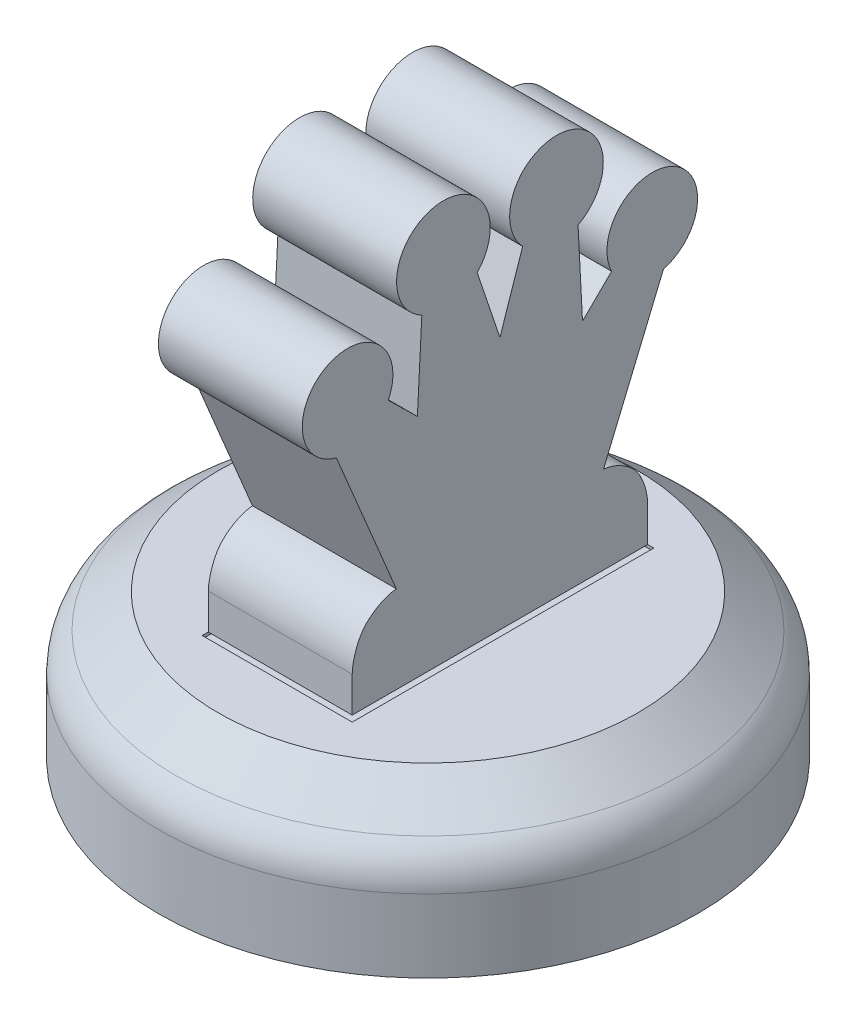
ISO-10303-21;
HEADER;
FILE_DESCRIPTION(('STEP AP214'),'2;1');
FILE_NAME('part.step','',(''),(''),'','','');
FILE_SCHEMA(('AUTOMOTIVE_DESIGN { 1 0 10303 214 1 1 1 1 }'));
ENDSEC;
DATA;
#1=APPLICATION_CONTEXT('core data for automotive mechanical design processes');
#2=APPLICATION_PROTOCOL_DEFINITION('international standard','automotive_design',2000,#1);
#3=PRODUCT_CONTEXT('',#1,'mechanical');
#4=PRODUCT('Part','Part','',(#3));
#5=PRODUCT_RELATED_PRODUCT_CATEGORY('part','',(#4));
#6=PRODUCT_DEFINITION_FORMATION('','',#4);
#7=PRODUCT_DEFINITION_CONTEXT('part definition',#1,'design');
#8=PRODUCT_DEFINITION('design','',#6,#7);
#9=PRODUCT_DEFINITION_SHAPE('','',#8);
#10=(LENGTH_UNIT() NAMED_UNIT(*) SI_UNIT(.MILLI.,.METRE.));
#11=(NAMED_UNIT(*) PLANE_ANGLE_UNIT() SI_UNIT($,.RADIAN.));
#12=(NAMED_UNIT(*) SI_UNIT($,.STERADIAN.) SOLID_ANGLE_UNIT());
#13=UNCERTAINTY_MEASURE_WITH_UNIT(LENGTH_MEASURE(1.E-05),#10,'distance_accuracy_value','');
#14=(GEOMETRIC_REPRESENTATION_CONTEXT(3) GLOBAL_UNCERTAINTY_ASSIGNED_CONTEXT((#13)) GLOBAL_UNIT_ASSIGNED_CONTEXT((#10,
#11,#12)) REPRESENTATION_CONTEXT('',''));
#15=CARTESIAN_POINT('',(0.,0.,0.));
#16=DIRECTION('',(0.,0.,1.));
#17=DIRECTION('',(1.,0.,0.));
#18=AXIS2_PLACEMENT_3D('',#15,#16,#17);
#19=CARTESIAN_POINT('',(4.7625,9.525,9.779));
#20=DIRECTION('',(0.,0.,-1.));
#21=DIRECTION('',(-1.,0.,0.));
#22=AXIS2_PLACEMENT_3D('',#19,#20,#21);
#23=PLANE('',#22);
#24=DIRECTION('',(0.,-1.,0.));
#25=VECTOR('',#24,1.);
#26=CARTESIAN_POINT('',(-4.7625,9.525,9.779));
#27=LINE('',#26,#25);
#28=CARTESIAN_POINT('',(-4.7625,12.065,9.779));
#29=VERTEX_POINT('',#28);
#30=CARTESIAN_POINT('',(-4.7625,9.7234375,9.779));
#31=VERTEX_POINT('',#30);
#32=EDGE_CURVE('E199',#29,#31,#27,.T.);
#33=ORIENTED_EDGE('',*,*,#32,.T.);
#34=DIRECTION('',(1.,0.,0.));
#35=VECTOR('',#34,1.);
#36=CARTESIAN_POINT('',(4.7625,9.7234375,9.779));
#37=LINE('',#36,#35);
#38=CARTESIAN_POINT('',(4.7625,9.7234375,9.779));
#39=VERTEX_POINT('',#38);
#40=EDGE_CURVE('E61',#31,#39,#37,.T.);
#41=ORIENTED_EDGE('',*,*,#40,.T.);
#42=DIRECTION('',(0.,-1.,0.));
#43=VECTOR('',#42,1.);
#44=CARTESIAN_POINT('',(4.7625,9.525,9.779));
#45=LINE('',#44,#43);
#46=CARTESIAN_POINT('',(4.7625,12.065,9.779));
#47=VERTEX_POINT('',#46);
#48=EDGE_CURVE('E370',#47,#39,#45,.T.);
#49=ORIENTED_EDGE('',*,*,#48,.F.);
#50=DIRECTION('',(-1.,0.,0.));
#51=VECTOR('',#50,1.);
#52=CARTESIAN_POINT('',(4.7625,12.065,9.779));
#53=LINE('',#52,#51);
#54=EDGE_CURVE('E192',#47,#29,#53,.T.);
#55=ORIENTED_EDGE('',*,*,#54,.T.);
#56=EDGE_LOOP('',(#33,#41,#49,#55));
#57=FACE_BOUND('',#56,.T.);
#58=ADVANCED_FACE('F47',(#57),#23,.F.);
#59=CARTESIAN_POINT('',(4.7625,9.525,-9.779));
#60=DIRECTION('',(0.,0.,1.));
#61=DIRECTION('',(1.,0.,0.));
#62=AXIS2_PLACEMENT_3D('',#59,#60,#61);
#63=PLANE('',#62);
#64=DIRECTION('',(0.,1.,0.));
#65=VECTOR('',#64,1.);
#66=CARTESIAN_POINT('',(4.7625,9.525,-9.779));
#67=LINE('',#66,#65);
#68=CARTESIAN_POINT('',(4.7625,9.7234375,-9.779));
#69=VERTEX_POINT('',#68);
#70=CARTESIAN_POINT('',(4.7625,12.065,-9.779));
#71=VERTEX_POINT('',#70);
#72=EDGE_CURVE('E131',#69,#71,#67,.T.);
#73=ORIENTED_EDGE('',*,*,#72,.F.);
#74=DIRECTION('',(-1.,0.,0.));
#75=VECTOR('',#74,1.);
#76=CARTESIAN_POINT('',(4.7625,9.7234375,-9.779));
#77=LINE('',#76,#75);
#78=CARTESIAN_POINT('',(-4.7625,9.7234375,-9.779));
#79=VERTEX_POINT('',#78);
#80=EDGE_CURVE('E380',#69,#79,#77,.T.);
#81=ORIENTED_EDGE('',*,*,#80,.T.);
#82=DIRECTION('',(0.,1.,0.));
#83=VECTOR('',#82,1.);
#84=CARTESIAN_POINT('',(-4.7625,9.525,-9.779));
#85=LINE('',#84,#83);
#86=CARTESIAN_POINT('',(-4.7625,12.065,-9.779));
#87=VERTEX_POINT('',#86);
#88=EDGE_CURVE('E337',#79,#87,#85,.T.);
#89=ORIENTED_EDGE('',*,*,#88,.T.);
#90=DIRECTION('',(-1.,0.,0.));
#91=VECTOR('',#90,1.);
#92=CARTESIAN_POINT('',(4.7625,12.065,-9.779));
#93=LINE('',#92,#91);
#94=EDGE_CURVE('E54',#71,#87,#93,.T.);
#95=ORIENTED_EDGE('',*,*,#94,.F.);
#96=EDGE_LOOP('',(#73,#81,#89,#95));
#97=FACE_BOUND('',#96,.T.);
#98=ADVANCED_FACE('F258',(#97),#63,.F.);
#99=CARTESIAN_POINT('',(4.7625,12.065,-9.779));
#100=CARTESIAN_POINT('',(4.7625,12.309468918613,-9.779));
#101=CARTESIAN_POINT('',(4.7625,12.8451886460168,-9.70122474852141));
#102=CARTESIAN_POINT('',(4.7625,13.6120337897192,-9.45354075319584));
#103=CARTESIAN_POINT('',(4.7625,14.3662098327036,-9.0379901102682));
#104=CARTESIAN_POINT('',(4.7625,14.9248956395259,-8.40518758041096));
#105=CARTESIAN_POINT('',(4.7625,15.3380357843992,-7.6672092800667));
#106=CARTESIAN_POINT('',(4.7625,15.476256725142,-7.12932513516018));
#107=CARTESIAN_POINT('',(4.7625,15.5044019386932,-6.85730117364538));
#108=B_SPLINE_CURVE_WITH_KNOTS('',3,(#99,#100,#101,#102,#103,#104,#105,#106,#107),.UNSPECIFIED.,
.F.,.F.,(4,1,1,1,1,1,4),(0.,0.148072563883558,0.327673483859106,0.488762490745578,
0.665615280153017,0.833548992252136,1.),.UNSPECIFIED.);
#109=DIRECTION('',(-1.,0.,0.));
#110=VECTOR('',#109,1.);
#111=SURFACE_OF_LINEAR_EXTRUSION('',#108,#110);
#112=CARTESIAN_POINT('',(-4.7625,12.065,-9.779));
#113=CARTESIAN_POINT('',(-4.7625,12.309468918613,-9.779));
#114=CARTESIAN_POINT('',(-4.7625,12.8451886460168,-9.70122474852141));
#115=CARTESIAN_POINT('',(-4.7625,13.6120337897192,-9.45354075319584));
#116=CARTESIAN_POINT('',(-4.7625,14.3662098327036,-9.0379901102682));
#117=CARTESIAN_POINT('',(-4.7625,14.9248956395259,-8.40518758041096));
#118=CARTESIAN_POINT('',(-4.7625,15.3380357843992,-7.6672092800667));
#119=CARTESIAN_POINT('',(-4.7625,15.476256725142,-7.12932513516018));
#120=CARTESIAN_POINT('',(-4.7625,15.5044019386932,-6.85730117364538));
#121=B_SPLINE_CURVE_WITH_KNOTS('',3,(#112,#113,#114,#115,#116,#117,#118,#119,#120),
.UNSPECIFIED.,.F.,.F.,(4,1,1,1,1,1,4),(0.,0.148072563883558,0.327673483859106,0.488762490745578,
0.665615280153017,0.833548992252136,1.),.UNSPECIFIED.);
#122=CARTESIAN_POINT('',(-4.7625,15.5044019386932,-6.85730117364538));
#123=VERTEX_POINT('',#122);
#124=EDGE_CURVE('E331',#87,#123,#121,.T.);
#125=ORIENTED_EDGE('',*,*,#124,.T.);
#126=DIRECTION('',(-1.,0.,0.));
#127=VECTOR('',#126,1.);
#128=CARTESIAN_POINT('',(4.7625,15.5044019386932,-6.85730117364538));
#129=LINE('',#128,#127);
#130=CARTESIAN_POINT('',(4.7625,15.5044019386932,-6.85730117364538));
#131=VERTEX_POINT('',#130);
#132=EDGE_CURVE('E325',#131,#123,#129,.T.);
#133=ORIENTED_EDGE('',*,*,#132,.F.);
#134=EDGE_CURVE('E260',#71,#131,#108,.T.);
#135=ORIENTED_EDGE('',*,*,#134,.F.);
#136=ORIENTED_EDGE('',*,*,#94,.T.);
#137=EDGE_LOOP('',(#125,#133,#135,#136));
#138=FACE_BOUND('',#137,.T.);
#139=ADVANCED_FACE('F254',(#138),#111,.F.);
#140=CARTESIAN_POINT('',(4.7625,15.5044019386932,-6.85730117364538));
#141=DIRECTION('',(0.,0.385969370221872,0.922511596268866));
#142=DIRECTION('',(0.,-0.922511596268866,0.385969370221872));
#143=AXIS2_PLACEMENT_3D('',#140,#141,#142);
#144=PLANE('',#143);
#145=DIRECTION('',(0.,0.922511596268866,-0.385969370221872));
#146=VECTOR('',#145,1.);
#147=CARTESIAN_POINT('',(-4.7625,15.5044019386932,-6.85730117364538));
#148=LINE('',#147,#146);
#149=CARTESIAN_POINT('',(-4.7625,24.99672792902,-10.8287928050192));
#150=VERTEX_POINT('',#149);
#151=EDGE_CURVE('E339',#123,#150,#148,.T.);
#152=ORIENTED_EDGE('',*,*,#151,.T.);
#153=DIRECTION('',(-1.,0.,0.));
#154=VECTOR('',#153,1.);
#155=CARTESIAN_POINT('',(4.7625,24.99672792902,-10.8287928050192));
#156=LINE('',#155,#154);
#157=CARTESIAN_POINT('',(4.7625,24.99672792902,-10.8287928050192));
#158=VERTEX_POINT('',#157);
#159=EDGE_CURVE('E322',#158,#150,#156,.T.);
#160=ORIENTED_EDGE('',*,*,#159,.F.);
#161=DIRECTION('',(0.,0.922511596268866,-0.385969370221872));
#162=VECTOR('',#161,1.);
#163=CARTESIAN_POINT('',(4.7625,15.5044019386932,-6.85730117364538));
#164=LINE('',#163,#162);
#165=EDGE_CURVE('E266',#131,#158,#164,.T.);
#166=ORIENTED_EDGE('',*,*,#165,.F.);
#167=ORIENTED_EDGE('',*,*,#132,.T.);
#168=EDGE_LOOP('',(#152,#160,#166,#167));
#169=FACE_BOUND('',#168,.T.);
#170=ADVANCED_FACE('F250',(#169),#144,.F.);
#171=CARTESIAN_POINT('',(4.7625,27.903237148507,-10.0855803758841));
#172=DIRECTION('',(-1.,0.,0.));
#173=DIRECTION('',(0.,0.,1.));
#174=AXIS2_PLACEMENT_3D('',#171,#172,#173);
#175=CYLINDRICAL_SURFACE('',#174,3.00002675951138);
#176=CARTESIAN_POINT('',(-4.7625,27.903237148507,-10.0855803758841));
#177=DIRECTION('',(1.,0.,0.));
#178=DIRECTION('',(0.,0.,-1.));
#179=AXIS2_PLACEMENT_3D('',#176,#177,#178);
#180=CIRCLE('',#179,3.00002675951138);
#181=CARTESIAN_POINT('',(-4.7625,26.5829752137657,-7.39168561523409));
#182=VERTEX_POINT('',#181);
#183=EDGE_CURVE('E341',#150,#182,#180,.T.);
#184=ORIENTED_EDGE('',*,*,#183,.T.);
#185=DIRECTION('',(-1.,0.,0.));
#186=VECTOR('',#185,1.);
#187=CARTESIAN_POINT('',(4.7625,26.5829752137657,-7.39168561523409));
#188=LINE('',#187,#186);
#189=CARTESIAN_POINT('',(4.7625,26.5829752137657,-7.39168561523409));
#190=VERTEX_POINT('',#189);
#191=EDGE_CURVE('E319',#190,#182,#188,.T.);
#192=ORIENTED_EDGE('',*,*,#191,.F.);
#193=CARTESIAN_POINT('',(4.7625,27.903237148507,-10.0855803758841));
#194=DIRECTION('',(1.,0.,0.));
#195=DIRECTION('',(0.,0.,-1.));
#196=AXIS2_PLACEMENT_3D('',#193,#194,#195);
#197=CIRCLE('',#196,3.00002675951138);
#198=EDGE_CURVE('E272',#158,#190,#197,.T.);
#199=ORIENTED_EDGE('',*,*,#198,.F.);
#200=ORIENTED_EDGE('',*,*,#159,.T.);
#201=EDGE_LOOP('',(#184,#192,#199,#200));
#202=FACE_BOUND('',#201,.T.);
#203=ADVANCED_FACE('F246',(#202),#175,.T.);
#204=CARTESIAN_POINT('',(4.7625,26.5829752137657,-7.39168561523409));
#205=DIRECTION('',(0.,-0.713106962515212,-0.701055247475067));
#206=DIRECTION('',(0.,0.701055247475067,-0.713106962515212));
#207=AXIS2_PLACEMENT_3D('',#204,#205,#206);
#208=PLANE('',#207);
#209=DIRECTION('',(0.,-0.701055247475067,0.713106962515212));
#210=VECTOR('',#209,1.);
#211=CARTESIAN_POINT('',(-4.7625,26.5829752137657,-7.39168561523409));
#212=LINE('',#211,#210);
#213=CARTESIAN_POINT('',(-4.7625,24.6892122169581,-5.46536727835407));
#214=VERTEX_POINT('',#213);
#215=EDGE_CURVE('E350',#182,#214,#212,.T.);
#216=ORIENTED_EDGE('',*,*,#215,.T.);
#217=DIRECTION('',(-1.,0.,0.));
#218=VECTOR('',#217,1.);
#219=CARTESIAN_POINT('',(4.7625,24.6892122169581,-5.46536727835407));
#220=LINE('',#219,#218);
#221=CARTESIAN_POINT('',(4.7625,24.6892122169581,-5.46536727835407));
#222=VERTEX_POINT('',#221);
#223=EDGE_CURVE('E316',#222,#214,#220,.T.);
#224=ORIENTED_EDGE('',*,*,#223,.F.);
#225=DIRECTION('',(0.,-0.701055247475067,0.713106962515212));
#226=VECTOR('',#225,1.);
#227=CARTESIAN_POINT('',(4.7625,26.5829752137657,-7.39168561523409));
#228=LINE('',#227,#226);
#229=EDGE_CURVE('E274',#190,#222,#228,.T.);
#230=ORIENTED_EDGE('',*,*,#229,.F.);
#231=ORIENTED_EDGE('',*,*,#191,.T.);
#232=EDGE_LOOP('',(#216,#224,#230,#231));
#233=FACE_BOUND('',#232,.T.);
#234=ADVANCED_FACE('F242',(#233),#208,.F.);
#235=CARTESIAN_POINT('',(4.7625,24.6892122169581,-5.46536727835407));
#236=DIRECTION('',(0.,-0.0520601547677918,0.998643950707936));
#237=DIRECTION('',(0.,-0.998643950707936,-0.0520601547677918));
#238=AXIS2_PLACEMENT_3D('',#235,#236,#237);
#239=PLANE('',#238);
#240=DIRECTION('',(0.,0.998643950707935,0.0520601547677918));
#241=VECTOR('',#240,1.);
#242=CARTESIAN_POINT('',(-4.7625,24.6892122169581,-5.46536727835407));
#243=LINE('',#242,#241);
#244=CARTESIAN_POINT('',(-4.7625,30.3496131382739,-5.17028578529286));
#245=VERTEX_POINT('',#244);
#246=EDGE_CURVE('E352',#214,#245,#243,.T.);
#247=ORIENTED_EDGE('',*,*,#246,.T.);
#248=DIRECTION('',(-1.,0.,0.));
#249=VECTOR('',#248,1.);
#250=CARTESIAN_POINT('',(4.7625,30.3496131382739,-5.17028578529286));
#251=LINE('',#250,#249);
#252=CARTESIAN_POINT('',(4.7625,30.3496131382739,-5.17028578529286));
#253=VERTEX_POINT('',#252);
#254=EDGE_CURVE('E313',#253,#245,#251,.T.);
#255=ORIENTED_EDGE('',*,*,#254,.F.);
#256=DIRECTION('',(0.,0.998643950707935,0.0520601547677918));
#257=VECTOR('',#256,1.);
#258=CARTESIAN_POINT('',(4.7625,24.6892122169581,-5.46536727835407));
#259=LINE('',#258,#257);
#260=EDGE_CURVE('E276',#222,#253,#259,.T.);
#261=ORIENTED_EDGE('',*,*,#260,.F.);
#262=ORIENTED_EDGE('',*,*,#223,.T.);
#263=EDGE_LOOP('',(#247,#255,#261,#262));
#264=FACE_BOUND('',#263,.T.);
#265=ADVANCED_FACE('F238',(#264),#239,.F.);
#266=CARTESIAN_POINT('',(4.7625,33.101675129507,-3.74254737761217));
#267=DIRECTION('',(-1.,0.,0.));
#268=DIRECTION('',(0.,0.,1.));
#269=AXIS2_PLACEMENT_3D('',#266,#267,#268);
#270=CYLINDRICAL_SURFACE('',#269,3.1003680691744);
#271=CARTESIAN_POINT('',(-4.7625,33.101675129507,-3.74254737761217));
#272=DIRECTION('',(1.,0.,0.));
#273=DIRECTION('',(0.,0.,-1.));
#274=AXIS2_PLACEMENT_3D('',#271,#272,#273);
#275=CIRCLE('',#274,3.1003680691744);
#276=CARTESIAN_POINT('',(-4.7625,30.9555664452199,-1.5050264995903));
#277=VERTEX_POINT('',#276);
#278=EDGE_CURVE('E354',#245,#277,#275,.T.);
#279=ORIENTED_EDGE('',*,*,#278,.T.);
#280=DIRECTION('',(-1.,0.,0.));
#281=VECTOR('',#280,1.);
#282=CARTESIAN_POINT('',(4.7625,30.9555664452199,-1.5050264995903));
#283=LINE('',#282,#281);
#284=CARTESIAN_POINT('',(4.7625,30.9555664452199,-1.5050264995903));
#285=VERTEX_POINT('',#284);
#286=EDGE_CURVE('E310',#285,#277,#283,.T.);
#287=ORIENTED_EDGE('',*,*,#286,.F.);
#288=CARTESIAN_POINT('',(4.7625,33.101675129507,-3.74254737761217));
#289=DIRECTION('',(1.,0.,0.));
#290=DIRECTION('',(0.,0.,-1.));
#291=AXIS2_PLACEMENT_3D('',#288,#289,#290);
#292=CIRCLE('',#291,3.1003680691744);
#293=EDGE_CURVE('E278',#253,#285,#292,.T.);
#294=ORIENTED_EDGE('',*,*,#293,.F.);
#295=ORIENTED_EDGE('',*,*,#254,.T.);
#296=EDGE_LOOP('',(#279,#287,#294,#295));
#297=FACE_BOUND('',#296,.T.);
#298=ADVANCED_FACE('F234',(#297),#270,.T.);
#299=CARTESIAN_POINT('',(4.7625,30.9555664452199,-1.5050264995903));
#300=DIRECTION('',(0.,-0.318862957576562,-0.947800830494217));
#301=DIRECTION('',(0.,0.947800830494217,-0.318862957576562));
#302=AXIS2_PLACEMENT_3D('',#299,#300,#301);
#303=PLANE('',#302);
#304=DIRECTION('',(0.,-0.947800830494217,0.318862957576562));
#305=VECTOR('',#304,1.);
#306=CARTESIAN_POINT('',(-4.7625,30.9555664452199,-1.5050264995903));
#307=LINE('',#306,#305);
#308=CARTESIAN_POINT('',(-4.7625,26.4819663222423,0.));
#309=VERTEX_POINT('',#308);
#310=EDGE_CURVE('E356',#277,#309,#307,.T.);
#311=ORIENTED_EDGE('',*,*,#310,.T.);
#312=DIRECTION('',(-1.,0.,0.));
#313=VECTOR('',#312,1.);
#314=CARTESIAN_POINT('',(4.7625,26.4819663222423,0.));
#315=LINE('',#314,#313);
#316=CARTESIAN_POINT('',(4.7625,26.4819663222423,0.));
#317=VERTEX_POINT('',#316);
#318=EDGE_CURVE('E307',#317,#309,#315,.T.);
#319=ORIENTED_EDGE('',*,*,#318,.F.);
#320=DIRECTION('',(0.,-0.947800830494217,0.318862957576562));
#321=VECTOR('',#320,1.);
#322=CARTESIAN_POINT('',(4.7625,30.9555664452199,-1.5050264995903));
#323=LINE('',#322,#321);
#324=EDGE_CURVE('E280',#285,#317,#323,.T.);
#325=ORIENTED_EDGE('',*,*,#324,.F.);
#326=ORIENTED_EDGE('',*,*,#286,.T.);
#327=EDGE_LOOP('',(#311,#319,#325,#326));
#328=FACE_BOUND('',#327,.T.);
#329=ADVANCED_FACE('F230',(#328),#303,.F.);
#330=CARTESIAN_POINT('',(4.7625,30.9555664452199,1.5050264995903));
#331=DIRECTION('',(0.,-0.318862957576562,0.947800830494217));
#332=DIRECTION('',(0.,-0.947800830494217,-0.318862957576562));
#333=AXIS2_PLACEMENT_3D('',#330,#331,#332);
#334=PLANE('',#333);
#335=DIRECTION('',(0.,0.947800830494217,0.318862957576562));
#336=VECTOR('',#335,1.);
#337=CARTESIAN_POINT('',(-4.7625,30.9555664452199,1.5050264995903));
#338=LINE('',#337,#336);
#339=CARTESIAN_POINT('',(-4.7625,30.9555664452199,1.5050264995903));
#340=VERTEX_POINT('',#339);
#341=EDGE_CURVE('E358',#309,#340,#338,.T.);
#342=ORIENTED_EDGE('',*,*,#341,.T.);
#343=DIRECTION('',(-1.,0.,0.));
#344=VECTOR('',#343,1.);
#345=CARTESIAN_POINT('',(4.7625,30.9555664452199,1.5050264995903));
#346=LINE('',#345,#344);
#347=CARTESIAN_POINT('',(4.7625,30.9555664452199,1.5050264995903));
#348=VERTEX_POINT('',#347);
#349=EDGE_CURVE('E304',#348,#340,#346,.T.);
#350=ORIENTED_EDGE('',*,*,#349,.F.);
#351=DIRECTION('',(0.,0.947800830494217,0.318862957576562));
#352=VECTOR('',#351,1.);
#353=CARTESIAN_POINT('',(4.7625,30.9555664452199,1.5050264995903));
#354=LINE('',#353,#352);
#355=EDGE_CURVE('E282',#317,#348,#354,.T.);
#356=ORIENTED_EDGE('',*,*,#355,.F.);
#357=ORIENTED_EDGE('',*,*,#318,.T.);
#358=EDGE_LOOP('',(#342,#350,#356,#357));
#359=FACE_BOUND('',#358,.T.);
#360=ADVANCED_FACE('F226',(#359),#334,.F.);
#361=CARTESIAN_POINT('',(4.7625,33.101675129507,3.74254737761217));
#362=DIRECTION('',(-1.,0.,0.));
#363=DIRECTION('',(0.,0.,1.));
#364=AXIS2_PLACEMENT_3D('',#361,#362,#363);
#365=CYLINDRICAL_SURFACE('',#364,3.1003680691744);
#366=CARTESIAN_POINT('',(-4.7625,33.101675129507,3.74254737761217));
#367=DIRECTION('',(1.,0.,0.));
#368=DIRECTION('',(0.,0.,1.));
#369=AXIS2_PLACEMENT_3D('',#366,#367,#368);
#370=CIRCLE('',#369,3.1003680691744);
#371=CARTESIAN_POINT('',(-4.7625,30.3496131382739,5.17028578529286));
#372=VERTEX_POINT('',#371);
#373=EDGE_CURVE('E360',#340,#372,#370,.T.);
#374=ORIENTED_EDGE('',*,*,#373,.T.);
#375=DIRECTION('',(-1.,0.,0.));
#376=VECTOR('',#375,1.);
#377=CARTESIAN_POINT('',(4.7625,30.3496131382739,5.17028578529286));
#378=LINE('',#377,#376);
#379=CARTESIAN_POINT('',(4.7625,30.3496131382739,5.17028578529286));
#380=VERTEX_POINT('',#379);
#381=EDGE_CURVE('E297',#380,#372,#378,.T.);
#382=ORIENTED_EDGE('',*,*,#381,.F.);
#383=CARTESIAN_POINT('',(4.7625,33.101675129507,3.74254737761217));
#384=DIRECTION('',(1.,0.,0.));
#385=DIRECTION('',(0.,0.,1.));
#386=AXIS2_PLACEMENT_3D('',#383,#384,#385);
#387=CIRCLE('',#386,3.1003680691744);
#388=EDGE_CURVE('E284',#348,#380,#387,.T.);
#389=ORIENTED_EDGE('',*,*,#388,.F.);
#390=ORIENTED_EDGE('',*,*,#349,.T.);
#391=EDGE_LOOP('',(#374,#382,#389,#390));
#392=FACE_BOUND('',#391,.T.);
#393=ADVANCED_FACE('F222',(#392),#365,.T.);
#394=CARTESIAN_POINT('',(4.7625,24.6892122169581,5.46536727835407));
#395=DIRECTION('',(0.,-0.0520601547677918,-0.998643950707936));
#396=DIRECTION('',(0.,0.998643950707936,-0.0520601547677918));
#397=AXIS2_PLACEMENT_3D('',#394,#395,#396);
#398=PLANE('',#397);
#399=DIRECTION('',(0.,-0.998643950707935,0.0520601547677918));
#400=VECTOR('',#399,1.);
#401=CARTESIAN_POINT('',(-4.7625,24.6892122169581,5.46536727835407));
#402=LINE('',#401,#400);
#403=CARTESIAN_POINT('',(-4.7625,24.6892122169581,5.46536727835407));
#404=VERTEX_POINT('',#403);
#405=EDGE_CURVE('E295',#372,#404,#402,.T.);
#406=ORIENTED_EDGE('',*,*,#405,.T.);
#407=DIRECTION('',(-1.,0.,0.));
#408=VECTOR('',#407,1.);
#409=CARTESIAN_POINT('',(4.7625,24.6892122169581,5.46536727835407));
#410=LINE('',#409,#408);
#411=CARTESIAN_POINT('',(4.7625,24.6892122169581,5.46536727835407));
#412=VERTEX_POINT('',#411);
#413=EDGE_CURVE('E293',#412,#404,#410,.T.);
#414=ORIENTED_EDGE('',*,*,#413,.F.);
#415=DIRECTION('',(0.,-0.998643950707935,0.0520601547677918));
#416=VECTOR('',#415,1.);
#417=CARTESIAN_POINT('',(4.7625,24.6892122169581,5.46536727835407));
#418=LINE('',#417,#416);
#419=EDGE_CURVE('E286',#380,#412,#418,.T.);
#420=ORIENTED_EDGE('',*,*,#419,.F.);
#421=ORIENTED_EDGE('',*,*,#381,.T.);
#422=EDGE_LOOP('',(#406,#414,#420,#421));
#423=FACE_BOUND('',#422,.T.);
#424=ADVANCED_FACE('F218',(#423),#398,.F.);
#425=CARTESIAN_POINT('',(4.7625,26.5829752137657,7.39168561523409));
#426=DIRECTION('',(0.,-0.713106962515212,0.701055247475067));
#427=DIRECTION('',(0.,-0.701055247475067,-0.713106962515212));
#428=AXIS2_PLACEMENT_3D('',#425,#426,#427);
#429=PLANE('',#428);
#430=DIRECTION('',(0.,0.701055247475067,0.713106962515212));
#431=VECTOR('',#430,1.);
#432=CARTESIAN_POINT('',(-4.7625,26.5829752137657,7.39168561523409));
#433=LINE('',#432,#431);
#434=CARTESIAN_POINT('',(-4.7625,26.5829752137657,7.39168561523409));
#435=VERTEX_POINT('',#434);
#436=EDGE_CURVE('E299',#404,#435,#433,.T.);
#437=ORIENTED_EDGE('',*,*,#436,.T.);
#438=DIRECTION('',(-1.,0.,0.));
#439=VECTOR('',#438,1.);
#440=CARTESIAN_POINT('',(4.7625,26.5829752137657,7.39168561523409));
#441=LINE('',#440,#439);
#442=CARTESIAN_POINT('',(4.7625,26.5829752137657,7.39168561523409));
#443=VERTEX_POINT('',#442);
#444=EDGE_CURVE('E187',#443,#435,#441,.T.);
#445=ORIENTED_EDGE('',*,*,#444,.F.);
#446=DIRECTION('',(0.,0.701055247475067,0.713106962515212));
#447=VECTOR('',#446,1.);
#448=CARTESIAN_POINT('',(4.7625,26.5829752137657,7.39168561523409));
#449=LINE('',#448,#447);
#450=EDGE_CURVE('E175',#412,#443,#449,.T.);
#451=ORIENTED_EDGE('',*,*,#450,.F.);
#452=ORIENTED_EDGE('',*,*,#413,.T.);
#453=EDGE_LOOP('',(#437,#445,#451,#452));
#454=FACE_BOUND('',#453,.T.);
#455=ADVANCED_FACE('F215',(#454),#429,.F.);
#456=CARTESIAN_POINT('',(4.7625,27.903237148507,10.0855803758841));
#457=DIRECTION('',(-1.,0.,0.));
#458=DIRECTION('',(0.,0.,1.));
#459=AXIS2_PLACEMENT_3D('',#456,#457,#458);
#460=CYLINDRICAL_SURFACE('',#459,3.00002675951138);
#461=CARTESIAN_POINT('',(-4.7625,27.903237148507,10.0855803758841));
#462=DIRECTION('',(1.,0.,0.));
#463=DIRECTION('',(0.,0.,1.));
#464=AXIS2_PLACEMENT_3D('',#461,#462,#463);
#465=CIRCLE('',#464,3.00002675951138);
#466=CARTESIAN_POINT('',(-4.7625,24.99672792902,10.8287928050192));
#467=VERTEX_POINT('',#466);
#468=EDGE_CURVE('E184',#435,#467,#465,.T.);
#469=ORIENTED_EDGE('',*,*,#468,.T.);
#470=DIRECTION('',(-1.,0.,0.));
#471=VECTOR('',#470,1.);
#472=CARTESIAN_POINT('',(4.7625,24.99672792902,10.8287928050192));
#473=LINE('',#472,#471);
#474=CARTESIAN_POINT('',(4.7625,24.99672792902,10.8287928050192));
#475=VERTEX_POINT('',#474);
#476=EDGE_CURVE('E181',#475,#467,#473,.T.);
#477=ORIENTED_EDGE('',*,*,#476,.F.);
#478=CARTESIAN_POINT('',(4.7625,27.903237148507,10.0855803758841));
#479=DIRECTION('',(1.,0.,0.));
#480=DIRECTION('',(0.,0.,1.));
#481=AXIS2_PLACEMENT_3D('',#478,#479,#480);
#482=CIRCLE('',#481,3.00002675951138);
#483=EDGE_CURVE('E168',#443,#475,#482,.T.);
#484=ORIENTED_EDGE('',*,*,#483,.F.);
#485=ORIENTED_EDGE('',*,*,#444,.T.);
#486=EDGE_LOOP('',(#469,#477,#484,#485));
#487=FACE_BOUND('',#486,.T.);
#488=ADVANCED_FACE('F182',(#487),#460,.T.);
#489=CARTESIAN_POINT('',(4.7625,15.5044019386932,6.85730117364538));
#490=DIRECTION('',(0.,0.385969370221872,-0.922511596268866));
#491=DIRECTION('',(0.,0.922511596268866,0.385969370221872));
#492=AXIS2_PLACEMENT_3D('',#489,#490,#491);
#493=PLANE('',#492);
#494=DIRECTION('',(0.,-0.922511596268866,-0.385969370221872));
#495=VECTOR('',#494,1.);
#496=CARTESIAN_POINT('',(-4.7625,15.5044019386932,6.85730117364538));
#497=LINE('',#496,#495);
#498=CARTESIAN_POINT('',(-4.7625,15.5044019386932,6.85730117364538));
#499=VERTEX_POINT('',#498);
#500=EDGE_CURVE('E365',#467,#499,#497,.T.);
#501=ORIENTED_EDGE('',*,*,#500,.T.);
#502=DIRECTION('',(-1.,0.,0.));
#503=VECTOR('',#502,1.);
#504=CARTESIAN_POINT('',(4.7625,15.5044019386932,6.85730117364538));
#505=LINE('',#504,#503);
#506=CARTESIAN_POINT('',(4.7625,15.5044019386932,6.85730117364538));
#507=VERTEX_POINT('',#506);
#508=EDGE_CURVE('E188',#507,#499,#505,.T.);
#509=ORIENTED_EDGE('',*,*,#508,.F.);
#510=DIRECTION('',(0.,-0.922511596268866,-0.385969370221872));
#511=VECTOR('',#510,1.);
#512=CARTESIAN_POINT('',(4.7625,15.5044019386932,6.85730117364538));
#513=LINE('',#512,#511);
#514=EDGE_CURVE('E172',#475,#507,#513,.T.);
#515=ORIENTED_EDGE('',*,*,#514,.F.);
#516=ORIENTED_EDGE('',*,*,#476,.T.);
#517=EDGE_LOOP('',(#501,#509,#515,#516));
#518=FACE_BOUND('',#517,.T.);
#519=ADVANCED_FACE('F190',(#518),#493,.F.);
#520=CARTESIAN_POINT('',(4.7625,15.5044019386932,6.85730117364538));
#521=CARTESIAN_POINT('',(4.7625,15.476256725142,7.12932513516018));
#522=CARTESIAN_POINT('',(4.7625,15.3380357843992,7.66720928006671));
#523=CARTESIAN_POINT('',(4.7625,14.9248956395259,8.40518758041096));
#524=CARTESIAN_POINT('',(4.7625,14.3662098327036,9.0379901102682));
#525=CARTESIAN_POINT('',(4.7625,13.6120337897192,9.45354075319584));
#526=CARTESIAN_POINT('',(4.7625,12.8451886460168,9.70122474852141));
#527=CARTESIAN_POINT('',(4.7625,12.309468918613,9.779));
#528=CARTESIAN_POINT('',(4.7625,12.065,9.779));
#529=B_SPLINE_CURVE_WITH_KNOTS('',3,(#520,#521,#522,#523,#524,#525,#526,#527,#528),
.UNSPECIFIED.,.F.,.F.,(4,1,1,1,1,1,4),(0.,0.166451007747864,0.334384719846983,0.511237509254422,
0.672326516140894,0.851927436116442,1.),.UNSPECIFIED.);
#530=DIRECTION('',(-1.,0.,0.));
#531=VECTOR('',#530,1.);
#532=SURFACE_OF_LINEAR_EXTRUSION('',#529,#531);
#533=CARTESIAN_POINT('',(-4.7625,15.5044019386932,6.85730117364538));
#534=CARTESIAN_POINT('',(-4.7625,15.476256725142,7.12932513516018));
#535=CARTESIAN_POINT('',(-4.7625,15.3380357843992,7.66720928006671));
#536=CARTESIAN_POINT('',(-4.7625,14.9248956395259,8.40518758041096));
#537=CARTESIAN_POINT('',(-4.7625,14.3662098327036,9.0379901102682));
#538=CARTESIAN_POINT('',(-4.7625,13.6120337897192,9.45354075319584));
#539=CARTESIAN_POINT('',(-4.7625,12.8451886460168,9.70122474852141));
#540=CARTESIAN_POINT('',(-4.7625,12.309468918613,9.779));
#541=CARTESIAN_POINT('',(-4.7625,12.065,9.779));
#542=B_SPLINE_CURVE_WITH_KNOTS('',3,(#533,#534,#535,#536,#537,#538,#539,#540,#541),
.UNSPECIFIED.,.F.,.F.,(4,1,1,1,1,1,4),(0.,0.166451007747864,0.334384719846983,0.511237509254422,
0.672326516140894,0.851927436116442,1.),.UNSPECIFIED.);
#543=EDGE_CURVE('E123',#499,#29,#542,.T.);
#544=ORIENTED_EDGE('',*,*,#543,.T.);
#545=ORIENTED_EDGE('',*,*,#54,.F.);
#546=EDGE_CURVE('E69',#507,#47,#529,.T.);
#547=ORIENTED_EDGE('',*,*,#546,.F.);
#548=ORIENTED_EDGE('',*,*,#508,.T.);
#549=EDGE_LOOP('',(#544,#545,#547,#548));
#550=FACE_BOUND('',#549,.T.);
#551=ADVANCED_FACE('F205',(#550),#532,.F.);
#552=CARTESIAN_POINT('',(4.7625,14.3592081892217,8.98148465256457));
#553=DIRECTION('',(1.,0.,0.));
#554=DIRECTION('',(0.,0.,-1.));
#555=AXIS2_PLACEMENT_3D('',#552,#553,#554);
#556=PLANE('',#555);
#557=DIRECTION('',(0.,0.,1.));
#558=VECTOR('',#557,1.);
#559=CARTESIAN_POINT('',(4.7625,9.7234375,8.98148465256457));
#560=LINE('',#559,#558);
#561=EDGE_CURVE('E377',#69,#39,#560,.T.);
#562=ORIENTED_EDGE('',*,*,#561,.F.);
#563=ORIENTED_EDGE('',*,*,#72,.T.);
#564=ORIENTED_EDGE('',*,*,#134,.T.);
#565=ORIENTED_EDGE('',*,*,#165,.T.);
#566=ORIENTED_EDGE('',*,*,#198,.T.);
#567=ORIENTED_EDGE('',*,*,#229,.T.);
#568=ORIENTED_EDGE('',*,*,#260,.T.);
#569=ORIENTED_EDGE('',*,*,#293,.T.);
#570=ORIENTED_EDGE('',*,*,#324,.T.);
#571=ORIENTED_EDGE('',*,*,#355,.T.);
#572=ORIENTED_EDGE('',*,*,#388,.T.);
#573=ORIENTED_EDGE('',*,*,#419,.T.);
#574=ORIENTED_EDGE('',*,*,#450,.T.);
#575=ORIENTED_EDGE('',*,*,#483,.T.);
#576=ORIENTED_EDGE('',*,*,#514,.T.);
#577=ORIENTED_EDGE('',*,*,#546,.T.);
#578=ORIENTED_EDGE('',*,*,#48,.T.);
#579=EDGE_LOOP('',(#562,#563,#564,#565,#566,#567,#568,#569,#570,#571,#572,#573,#574,#575,#576,
#577,#578));
#580=FACE_BOUND('',#579,.T.);
#581=ADVANCED_FACE('F170',(#580),#556,.T.);
#582=CARTESIAN_POINT('',(-4.7625,14.3592081892217,8.98148465256457));
#583=DIRECTION('',(1.,0.,0.));
#584=DIRECTION('',(0.,0.,-1.));
#585=AXIS2_PLACEMENT_3D('',#582,#583,#584);
#586=PLANE('',#585);
#587=ORIENTED_EDGE('',*,*,#88,.F.);
#588=DIRECTION('',(0.,0.,1.));
#589=VECTOR('',#588,1.);
#590=CARTESIAN_POINT('',(-4.7625,9.7234375,8.98148465256457));
#591=LINE('',#590,#589);
#592=EDGE_CURVE('E12',#79,#31,#591,.T.);
#593=ORIENTED_EDGE('',*,*,#592,.T.);
#594=ORIENTED_EDGE('',*,*,#32,.F.);
#595=ORIENTED_EDGE('',*,*,#543,.F.);
#596=ORIENTED_EDGE('',*,*,#500,.F.);
#597=ORIENTED_EDGE('',*,*,#468,.F.);
#598=ORIENTED_EDGE('',*,*,#436,.F.);
#599=ORIENTED_EDGE('',*,*,#405,.F.);
#600=ORIENTED_EDGE('',*,*,#373,.F.);
#601=ORIENTED_EDGE('',*,*,#341,.F.);
#602=ORIENTED_EDGE('',*,*,#310,.F.);
#603=ORIENTED_EDGE('',*,*,#278,.F.);
#604=ORIENTED_EDGE('',*,*,#246,.F.);
#605=ORIENTED_EDGE('',*,*,#215,.F.);
#606=ORIENTED_EDGE('',*,*,#183,.F.);
#607=ORIENTED_EDGE('',*,*,#151,.F.);
#608=ORIENTED_EDGE('',*,*,#124,.F.);
#609=EDGE_LOOP('',(#587,#593,#594,#595,#596,#597,#598,#599,#600,#601,#602,#603,#604,#605,#606,
#607,#608));
#610=FACE_BOUND('',#609,.T.);
#611=ADVANCED_FACE('F209',(#610),#586,.F.);
#612=CARTESIAN_POINT('',(0.,9.7234375,0.));
#613=DIRECTION('',(0.,1.,0.));
#614=DIRECTION('',(0.,0.,1.));
#615=AXIS2_PLACEMENT_3D('',#612,#613,#614);
#616=PLANE('',#615);
#617=ORIENTED_EDGE('',*,*,#561,.T.);
#618=ORIENTED_EDGE('',*,*,#40,.F.);
#619=ORIENTED_EDGE('',*,*,#592,.F.);
#620=ORIENTED_EDGE('',*,*,#80,.F.);
#621=EDGE_LOOP('',(#617,#618,#619,#620));
#622=FACE_BOUND('',#621,.T.);
#623=ADVANCED_FACE('F393',(#622),#616,.F.);
#624=CLOSED_SHELL('',(#58,#98,#139,#170,#203,#234,#265,#298,#329,#360,#393,#424,#455,#488,#519,
#551,#581,#611,#623));
#625=MANIFOLD_SOLID_BREP('B2',#624);
#626=CARTESIAN_POINT('',(0.,4.7625,0.));
#627=DIRECTION('',(0.,-1.,0.));
#628=DIRECTION('',(0.,0.,-1.));
#629=AXIS2_PLACEMENT_3D('',#626,#627,#628);
#630=CYLINDRICAL_SURFACE('',#629,2.59079999999997);
#631=CARTESIAN_POINT('',(0.,4.7625,0.));
#632=DIRECTION('',(0.,-1.,0.));
#633=DIRECTION('',(0.,0.,-1.));
#634=AXIS2_PLACEMENT_3D('',#631,#632,#633);
#635=CIRCLE('',#634,2.59079999999999);
#636=CARTESIAN_POINT('',(0.,4.7625,-2.59079999999999));
#637=VERTEX_POINT('',#636);
#638=EDGE_CURVE('E628',#637,#637,#635,.T.);
#639=ORIENTED_EDGE('',*,*,#638,.T.);
#640=EDGE_LOOP('',(#639));
#641=FACE_BOUND('',#640,.T.);
#642=CARTESIAN_POINT('',(0.,9.3265625,0.));
#643=DIRECTION('',(0.,1.,0.));
#644=DIRECTION('',(0.,0.,1.));
#645=AXIS2_PLACEMENT_3D('',#642,#643,#644);
#646=CIRCLE('',#645,2.59079999999997);
#647=CARTESIAN_POINT('',(0.,9.3265625,2.59079999999997));
#648=VERTEX_POINT('',#647);
#649=EDGE_CURVE('E623',#648,#648,#646,.F.);
#650=ORIENTED_EDGE('',*,*,#649,.F.);
#651=EDGE_LOOP('',(#650));
#652=FACE_BOUND('',#651,.T.);
#653=ADVANCED_FACE('F530',(#641,#652),#630,.F.);
#654=CARTESIAN_POINT('',(0.,6.35,0.));
#655=DIRECTION('',(0.,-1.,0.));
#656=DIRECTION('',(0.,0.,-1.));
#657=AXIS2_PLACEMENT_3D('',#654,#655,#656);
#658=CYLINDRICAL_SURFACE('',#657,17.859375);
#659=CARTESIAN_POINT('',(0.,4.82401610923014,0.));
#660=DIRECTION('',(0.,-1.,0.));
#661=DIRECTION('',(1.,0.,0.));
#662=AXIS2_PLACEMENT_3D('',#659,#660,#661);
#663=CIRCLE('',#662,17.859375);
#664=CARTESIAN_POINT('',(17.859375,4.82401610923015,0.));
#665=VERTEX_POINT('',#664);
#666=EDGE_CURVE('E45',#665,#665,#663,.T.);
#667=ORIENTED_EDGE('',*,*,#666,.T.);
#668=EDGE_LOOP('',(#667));
#669=FACE_BOUND('',#668,.T.);
#670=CARTESIAN_POINT('',(0.,0.,0.));
#671=DIRECTION('',(0.,1.,0.));
#672=DIRECTION('',(0.,0.,1.));
#673=AXIS2_PLACEMENT_3D('',#670,#671,#672);
#674=CIRCLE('',#673,17.859375);
#675=CARTESIAN_POINT('',(0.,0.,17.859375));
#676=VERTEX_POINT('',#675);
#677=EDGE_CURVE('E664',#676,#676,#674,.T.);
#678=ORIENTED_EDGE('',*,*,#677,.T.);
#679=EDGE_LOOP('',(#678));
#680=FACE_BOUND('',#679,.T.);
#681=ADVANCED_FACE('F690',(#669,#680),#658,.T.);
#682=CARTESIAN_POINT('',(0.,0.,0.));
#683=DIRECTION('',(0.,1.,0.));
#684=DIRECTION('',(0.,0.,1.));
#685=AXIS2_PLACEMENT_3D('',#682,#683,#684);
#686=PLANE('',#685);
#687=DIRECTION('',(-1.,0.,0.));
#688=VECTOR('',#687,1.);
#689=CARTESIAN_POINT('',(-6.4516,0.,9.6266));
#690=LINE('',#689,#688);
#691=CARTESIAN_POINT('',(6.4516,0.,9.6266));
#692=VERTEX_POINT('',#691);
#693=CARTESIAN_POINT('',(-6.4516,0.,9.6266));
#694=VERTEX_POINT('',#693);
#695=EDGE_CURVE('E646',#692,#694,#690,.T.);
#696=ORIENTED_EDGE('',*,*,#695,.F.);
#697=DIRECTION('',(0.,0.,1.));
#698=VECTOR('',#697,1.);
#699=CARTESIAN_POINT('',(6.4516,0.,-9.6266));
#700=LINE('',#699,#698);
#701=CARTESIAN_POINT('',(6.4516,0.,-9.6266));
#702=VERTEX_POINT('',#701);
#703=EDGE_CURVE('E553',#702,#692,#700,.T.);
#704=ORIENTED_EDGE('',*,*,#703,.F.);
#705=DIRECTION('',(1.,0.,0.));
#706=VECTOR('',#705,1.);
#707=CARTESIAN_POINT('',(-6.4516,0.,-9.6266));
#708=LINE('',#707,#706);
#709=CARTESIAN_POINT('',(-6.4516,0.,-9.6266));
#710=VERTEX_POINT('',#709);
#711=EDGE_CURVE('E635',#710,#702,#708,.T.);
#712=ORIENTED_EDGE('',*,*,#711,.F.);
#713=DIRECTION('',(0.,0.,-1.));
#714=VECTOR('',#713,1.);
#715=CARTESIAN_POINT('',(-6.4516,0.,-9.6266));
#716=LINE('',#715,#714);
#717=EDGE_CURVE('E649',#694,#710,#716,.T.);
#718=ORIENTED_EDGE('',*,*,#717,.F.);
#719=EDGE_LOOP('',(#696,#704,#712,#718));
#720=FACE_BOUND('',#719,.T.);
#721=ORIENTED_EDGE('',*,*,#677,.F.);
#722=EDGE_LOOP('',(#721));
#723=FACE_BOUND('',#722,.T.);
#724=ADVANCED_FACE('F696',(#720,#723),#686,.F.);
#725=CARTESIAN_POINT('',(-13.890625,9.525,0.));
#726=DIRECTION('',(0.,1.,0.));
#727=DIRECTION('',(-1.,0.,0.));
#728=AXIS2_PLACEMENT_3D('',#725,#726,#727);
#729=PLANE('',#728);
#730=DIRECTION('',(0.,0.,-1.));
#731=VECTOR('',#730,1.);
#732=CARTESIAN_POINT('',(4.9657,9.525,0.));
#733=LINE('',#732,#731);
#734=CARTESIAN_POINT('',(4.9657,9.525,9.9822));
#735=VERTEX_POINT('',#734);
#736=CARTESIAN_POINT('',(4.9657,9.525,-9.9822));
#737=VERTEX_POINT('',#736);
#738=EDGE_CURVE('E600',#735,#737,#733,.T.);
#739=ORIENTED_EDGE('',*,*,#738,.F.);
#740=DIRECTION('',(1.,0.,0.));
#741=VECTOR('',#740,1.);
#742=CARTESIAN_POINT('',(-13.890625,9.525,9.9822));
#743=LINE('',#742,#741);
#744=CARTESIAN_POINT('',(-4.9657,9.525,9.9822));
#745=VERTEX_POINT('',#744);
#746=EDGE_CURVE('E673',#745,#735,#743,.T.);
#747=ORIENTED_EDGE('',*,*,#746,.F.);
#748=DIRECTION('',(0.,0.,1.));
#749=VECTOR('',#748,1.);
#750=CARTESIAN_POINT('',(-4.9657,9.525,0.));
#751=LINE('',#750,#749);
#752=CARTESIAN_POINT('',(-4.9657,9.525,-9.9822));
#753=VERTEX_POINT('',#752);
#754=EDGE_CURVE('E671',#753,#745,#751,.T.);
#755=ORIENTED_EDGE('',*,*,#754,.F.);
#756=DIRECTION('',(-1.,0.,0.));
#757=VECTOR('',#756,1.);
#758=CARTESIAN_POINT('',(-13.890625,9.525,-9.9822));
#759=LINE('',#758,#757);
#760=EDGE_CURVE('E667',#737,#753,#759,.T.);
#761=ORIENTED_EDGE('',*,*,#760,.F.);
#762=EDGE_LOOP('',(#739,#747,#755,#761));
#763=FACE_BOUND('',#762,.T.);
#764=CARTESIAN_POINT('',(0.,9.525,0.));
#765=DIRECTION('',(0.,1.,0.));
#766=DIRECTION('',(-1.,0.,0.));
#767=AXIS2_PLACEMENT_3D('',#764,#765,#766);
#768=CIRCLE('',#767,13.890625);
#769=CARTESIAN_POINT('',(-13.890625,9.525,0.));
#770=VERTEX_POINT('',#769);
#771=EDGE_CURVE('E656',#770,#770,#768,.T.);
#772=ORIENTED_EDGE('',*,*,#771,.T.);
#773=EDGE_LOOP('',(#772));
#774=FACE_BOUND('',#773,.T.);
#775=ADVANCED_FACE('F722',(#763,#774),#729,.T.);
#776=CARTESIAN_POINT('',(0.,9.525,0.));
#777=DIRECTION('',(0.,-1.,0.));
#778=DIRECTION('',(1.,0.,0.));
#779=AXIS2_PLACEMENT_3D('',#776,#777,#778);
#780=CONICAL_SURFACE('',#779,13.890625,0.896055384571344);
#781=CARTESIAN_POINT('',(0.,7.30327457921177,0.));
#782=DIRECTION('',(0.,-1.,0.));
#783=DIRECTION('',(1.,0.,0.));
#784=AXIS2_PLACEMENT_3D('',#781,#782,#783);
#785=CIRCLE('',#784,16.6677817759853);
#786=CARTESIAN_POINT('',(16.6677817759853,7.30327457921177,0.));
#787=VERTEX_POINT('',#786);
#788=EDGE_CURVE('E538',#787,#787,#785,.F.);
#789=ORIENTED_EDGE('',*,*,#788,.T.);
#790=EDGE_LOOP('',(#789));
#791=FACE_BOUND('',#790,.T.);
#792=ORIENTED_EDGE('',*,*,#771,.F.);
#793=EDGE_LOOP('',(#792));
#794=FACE_BOUND('',#793,.T.);
#795=ADVANCED_FACE('F678',(#791,#794),#780,.T.);
#796=CARTESIAN_POINT('',(6.4516,4.7625,-9.6266));
#797=DIRECTION('',(1.,0.,0.));
#798=DIRECTION('',(0.,0.,-1.));
#799=AXIS2_PLACEMENT_3D('',#796,#797,#798);
#800=PLANE('',#799);
#801=ORIENTED_EDGE('',*,*,#703,.T.);
#802=DIRECTION('',(0.,-1.,0.));
#803=VECTOR('',#802,1.);
#804=CARTESIAN_POINT('',(6.4516,4.7625,9.6266));
#805=LINE('',#804,#803);
#806=CARTESIAN_POINT('',(6.4516,4.7625,9.6266));
#807=VERTEX_POINT('',#806);
#808=EDGE_CURVE('E644',#807,#692,#805,.T.);
#809=ORIENTED_EDGE('',*,*,#808,.F.);
#810=DIRECTION('',(0.,0.,1.));
#811=VECTOR('',#810,1.);
#812=CARTESIAN_POINT('',(6.4516,4.7625,-9.6266));
#813=LINE('',#812,#811);
#814=CARTESIAN_POINT('',(6.4516,4.7625,-9.6266));
#815=VERTEX_POINT('',#814);
#816=EDGE_CURVE('E631',#815,#807,#813,.T.);
#817=ORIENTED_EDGE('',*,*,#816,.F.);
#818=DIRECTION('',(0.,-1.,0.));
#819=VECTOR('',#818,1.);
#820=CARTESIAN_POINT('',(6.4516,4.7625,-9.6266));
#821=LINE('',#820,#819);
#822=EDGE_CURVE('E654',#815,#702,#821,.T.);
#823=ORIENTED_EDGE('',*,*,#822,.T.);
#824=EDGE_LOOP('',(#801,#809,#817,#823));
#825=FACE_BOUND('',#824,.T.);
#826=ADVANCED_FACE('F710',(#825),#800,.F.);
#827=CARTESIAN_POINT('',(-6.4516,4.7625,-9.6266));
#828=DIRECTION('',(0.,0.,-1.));
#829=DIRECTION('',(-1.,0.,0.));
#830=AXIS2_PLACEMENT_3D('',#827,#828,#829);
#831=PLANE('',#830);
#832=ORIENTED_EDGE('',*,*,#711,.T.);
#833=ORIENTED_EDGE('',*,*,#822,.F.);
#834=DIRECTION('',(1.,0.,0.));
#835=VECTOR('',#834,1.);
#836=CARTESIAN_POINT('',(-6.4516,4.7625,-9.6266));
#837=LINE('',#836,#835);
#838=CARTESIAN_POINT('',(-6.4516,4.7625,-9.6266));
#839=VERTEX_POINT('',#838);
#840=EDGE_CURVE('E641',#839,#815,#837,.T.);
#841=ORIENTED_EDGE('',*,*,#840,.F.);
#842=DIRECTION('',(0.,-1.,0.));
#843=VECTOR('',#842,1.);
#844=CARTESIAN_POINT('',(-6.4516,4.7625,-9.6266));
#845=LINE('',#844,#843);
#846=EDGE_CURVE('E657',#839,#710,#845,.T.);
#847=ORIENTED_EDGE('',*,*,#846,.T.);
#848=EDGE_LOOP('',(#832,#833,#841,#847));
#849=FACE_BOUND('',#848,.T.);
#850=ADVANCED_FACE('F706',(#849),#831,.F.);
#851=CARTESIAN_POINT('',(-6.4516,4.7625,-9.6266));
#852=DIRECTION('',(-1.,0.,0.));
#853=DIRECTION('',(0.,0.,1.));
#854=AXIS2_PLACEMENT_3D('',#851,#852,#853);
#855=PLANE('',#854);
#856=ORIENTED_EDGE('',*,*,#717,.T.);
#857=ORIENTED_EDGE('',*,*,#846,.F.);
#858=DIRECTION('',(0.,0.,-1.));
#859=VECTOR('',#858,1.);
#860=CARTESIAN_POINT('',(-6.4516,4.7625,-9.6266));
#861=LINE('',#860,#859);
#862=CARTESIAN_POINT('',(-6.4516,4.7625,9.6266));
#863=VERTEX_POINT('',#862);
#864=EDGE_CURVE('E638',#863,#839,#861,.T.);
#865=ORIENTED_EDGE('',*,*,#864,.F.);
#866=DIRECTION('',(0.,-1.,0.));
#867=VECTOR('',#866,1.);
#868=CARTESIAN_POINT('',(-6.4516,4.7625,9.6266));
#869=LINE('',#868,#867);
#870=EDGE_CURVE('E659',#863,#694,#869,.T.);
#871=ORIENTED_EDGE('',*,*,#870,.T.);
#872=EDGE_LOOP('',(#856,#857,#865,#871));
#873=FACE_BOUND('',#872,.T.);
#874=ADVANCED_FACE('F709',(#873),#855,.F.);
#875=CARTESIAN_POINT('',(-6.4516,4.7625,9.6266));
#876=DIRECTION('',(0.,0.,1.));
#877=DIRECTION('',(1.,0.,0.));
#878=AXIS2_PLACEMENT_3D('',#875,#876,#877);
#879=PLANE('',#878);
#880=ORIENTED_EDGE('',*,*,#695,.T.);
#881=ORIENTED_EDGE('',*,*,#870,.F.);
#882=DIRECTION('',(-1.,0.,0.));
#883=VECTOR('',#882,1.);
#884=CARTESIAN_POINT('',(-6.4516,4.7625,9.6266));
#885=LINE('',#884,#883);
#886=EDGE_CURVE('E634',#807,#863,#885,.T.);
#887=ORIENTED_EDGE('',*,*,#886,.F.);
#888=ORIENTED_EDGE('',*,*,#808,.T.);
#889=EDGE_LOOP('',(#880,#881,#887,#888));
#890=FACE_BOUND('',#889,.T.);
#891=ADVANCED_FACE('F704',(#890),#879,.F.);
#892=CARTESIAN_POINT('',(0.,4.7625,0.));
#893=DIRECTION('',(0.,1.,0.));
#894=DIRECTION('',(0.,0.,1.));
#895=AXIS2_PLACEMENT_3D('',#892,#893,#894);
#896=PLANE('',#895);
#897=ORIENTED_EDGE('',*,*,#638,.F.);
#898=EDGE_LOOP('',(#897));
#899=FACE_BOUND('',#898,.T.);
#900=ORIENTED_EDGE('',*,*,#816,.T.);
#901=ORIENTED_EDGE('',*,*,#886,.T.);
#902=ORIENTED_EDGE('',*,*,#864,.T.);
#903=ORIENTED_EDGE('',*,*,#840,.T.);
#904=EDGE_LOOP('',(#900,#901,#902,#903));
#905=FACE_BOUND('',#904,.T.);
#906=ADVANCED_FACE('F701',(#899,#905),#896,.F.);
#907=CARTESIAN_POINT('',(0.,9.3265625,0.));
#908=DIRECTION('',(0.,1.,0.));
#909=DIRECTION('',(0.,0.,1.));
#910=AXIS2_PLACEMENT_3D('',#907,#908,#909);
#911=PLANE('',#910);
#912=DIRECTION('',(0.,0.,-1.));
#913=VECTOR('',#912,1.);
#914=CARTESIAN_POINT('',(4.9657,9.3265625,9.9822));
#915=LINE('',#914,#913);
#916=CARTESIAN_POINT('',(4.9657,9.3265625,9.9822));
#917=VERTEX_POINT('',#916);
#918=CARTESIAN_POINT('',(4.9657,9.3265625,-9.9822));
#919=VERTEX_POINT('',#918);
#920=EDGE_CURVE('E597',#917,#919,#915,.T.);
#921=ORIENTED_EDGE('',*,*,#920,.T.);
#922=DIRECTION('',(-1.,0.,0.));
#923=VECTOR('',#922,1.);
#924=CARTESIAN_POINT('',(4.9657,9.3265625,-9.9822));
#925=LINE('',#924,#923);
#926=CARTESIAN_POINT('',(-4.9657,9.3265625,-9.9822));
#927=VERTEX_POINT('',#926);
#928=EDGE_CURVE('E606',#919,#927,#925,.T.);
#929=ORIENTED_EDGE('',*,*,#928,.T.);
#930=DIRECTION('',(0.,0.,1.));
#931=VECTOR('',#930,1.);
#932=CARTESIAN_POINT('',(-4.9657,9.3265625,-9.9822));
#933=LINE('',#932,#931);
#934=CARTESIAN_POINT('',(-4.9657,9.3265625,9.9822));
#935=VERTEX_POINT('',#934);
#936=EDGE_CURVE('E612',#927,#935,#933,.T.);
#937=ORIENTED_EDGE('',*,*,#936,.T.);
#938=DIRECTION('',(1.,0.,0.));
#939=VECTOR('',#938,1.);
#940=CARTESIAN_POINT('',(-4.9657,9.3265625,9.9822));
#941=LINE('',#940,#939);
#942=EDGE_CURVE('E603',#935,#917,#941,.T.);
#943=ORIENTED_EDGE('',*,*,#942,.T.);
#944=EDGE_LOOP('',(#921,#929,#937,#943));
#945=FACE_BOUND('',#944,.T.);
#946=ORIENTED_EDGE('',*,*,#649,.T.);
#947=EDGE_LOOP('',(#946));
#948=FACE_BOUND('',#947,.T.);
#949=ADVANCED_FACE('F614',(#945,#948),#911,.T.);
#950=CARTESIAN_POINT('',(4.9657,9.3265625,9.9822));
#951=DIRECTION('',(1.,0.,0.));
#952=DIRECTION('',(0.,1.,0.));
#953=AXIS2_PLACEMENT_3D('',#950,#951,#952);
#954=PLANE('',#953);
#955=ORIENTED_EDGE('',*,*,#738,.T.);
#956=DIRECTION('',(0.,1.,0.));
#957=VECTOR('',#956,1.);
#958=CARTESIAN_POINT('',(4.9657,9.3265625,-9.9822));
#959=LINE('',#958,#957);
#960=EDGE_CURVE('E545',#919,#737,#959,.T.);
#961=ORIENTED_EDGE('',*,*,#960,.F.);
#962=ORIENTED_EDGE('',*,*,#920,.F.);
#963=DIRECTION('',(0.,1.,0.));
#964=VECTOR('',#963,1.);
#965=CARTESIAN_POINT('',(4.9657,9.3265625,9.9822));
#966=LINE('',#965,#964);
#967=EDGE_CURVE('E621',#917,#735,#966,.T.);
#968=ORIENTED_EDGE('',*,*,#967,.T.);
#969=EDGE_LOOP('',(#955,#961,#962,#968));
#970=FACE_BOUND('',#969,.T.);
#971=ADVANCED_FACE('F594',(#970),#954,.F.);
#972=CARTESIAN_POINT('',(-4.9657,9.3265625,9.9822));
#973=DIRECTION('',(0.,0.,1.));
#974=DIRECTION('',(1.,0.,0.));
#975=AXIS2_PLACEMENT_3D('',#972,#973,#974);
#976=PLANE('',#975);
#977=ORIENTED_EDGE('',*,*,#746,.T.);
#978=ORIENTED_EDGE('',*,*,#967,.F.);
#979=ORIENTED_EDGE('',*,*,#942,.F.);
#980=DIRECTION('',(0.,1.,0.));
#981=VECTOR('',#980,1.);
#982=CARTESIAN_POINT('',(-4.9657,9.3265625,9.9822));
#983=LINE('',#982,#981);
#984=EDGE_CURVE('E624',#935,#745,#983,.T.);
#985=ORIENTED_EDGE('',*,*,#984,.T.);
#986=EDGE_LOOP('',(#977,#978,#979,#985));
#987=FACE_BOUND('',#986,.T.);
#988=ADVANCED_FACE('F783',(#987),#976,.F.);
#989=CARTESIAN_POINT('',(-4.9657,9.3265625,-9.9822));
#990=DIRECTION('',(-1.,0.,0.));
#991=DIRECTION('',(0.,-1.,0.));
#992=AXIS2_PLACEMENT_3D('',#989,#990,#991);
#993=PLANE('',#992);
#994=ORIENTED_EDGE('',*,*,#754,.T.);
#995=ORIENTED_EDGE('',*,*,#984,.F.);
#996=ORIENTED_EDGE('',*,*,#936,.F.);
#997=DIRECTION('',(0.,1.,0.));
#998=VECTOR('',#997,1.);
#999=CARTESIAN_POINT('',(-4.9657,9.3265625,-9.9822));
#1000=LINE('',#999,#998);
#1001=EDGE_CURVE('E602',#927,#753,#1000,.T.);
#1002=ORIENTED_EDGE('',*,*,#1001,.T.);
#1003=EDGE_LOOP('',(#994,#995,#996,#1002));
#1004=FACE_BOUND('',#1003,.T.);
#1005=ADVANCED_FACE('F686',(#1004),#993,.F.);
#1006=CARTESIAN_POINT('',(4.9657,9.3265625,-9.9822));
#1007=DIRECTION('',(0.,0.,-1.));
#1008=DIRECTION('',(-1.,0.,0.));
#1009=AXIS2_PLACEMENT_3D('',#1006,#1007,#1008);
#1010=PLANE('',#1009);
#1011=ORIENTED_EDGE('',*,*,#760,.T.);
#1012=ORIENTED_EDGE('',*,*,#1001,.F.);
#1013=ORIENTED_EDGE('',*,*,#928,.F.);
#1014=ORIENTED_EDGE('',*,*,#960,.T.);
#1015=EDGE_LOOP('',(#1011,#1012,#1013,#1014));
#1016=FACE_BOUND('',#1015,.T.);
#1017=ADVANCED_FACE('F607',(#1016),#1010,.F.);
#1018=CARTESIAN_POINT('',(0.,4.82401610923014,0.));
#1019=DIRECTION('',(0.,-1.,0.));
#1020=DIRECTION('',(1.,0.,0.));
#1021=AXIS2_PLACEMENT_3D('',#1018,#1019,#1020);
#1022=TOROIDAL_SURFACE('',#1021,14.684375,3.175);
#1023=ORIENTED_EDGE('',*,*,#666,.F.);
#1024=EDGE_LOOP('',(#1023));
#1025=FACE_BOUND('',#1024,.T.);
#1026=ORIENTED_EDGE('',*,*,#788,.F.);
#1027=EDGE_LOOP('',(#1026));
#1028=FACE_BOUND('',#1027,.T.);
#1029=ADVANCED_FACE('F532',(#1025,#1028),#1022,.T.);
#1030=CLOSED_SHELL('',(#653,#681,#724,#775,#795,#826,#850,#874,#891,#906,#949,#971,#988,#1005,
#1017,#1029));
#1031=MANIFOLD_SOLID_BREP('B6',#1030);
#1032=ADVANCED_BREP_SHAPE_REPRESENTATION('',(#18,#625,#1031),#14);
#1033=SHAPE_DEFINITION_REPRESENTATION(#9,#1032);
ENDSEC;
END-ISO-10303-21;
